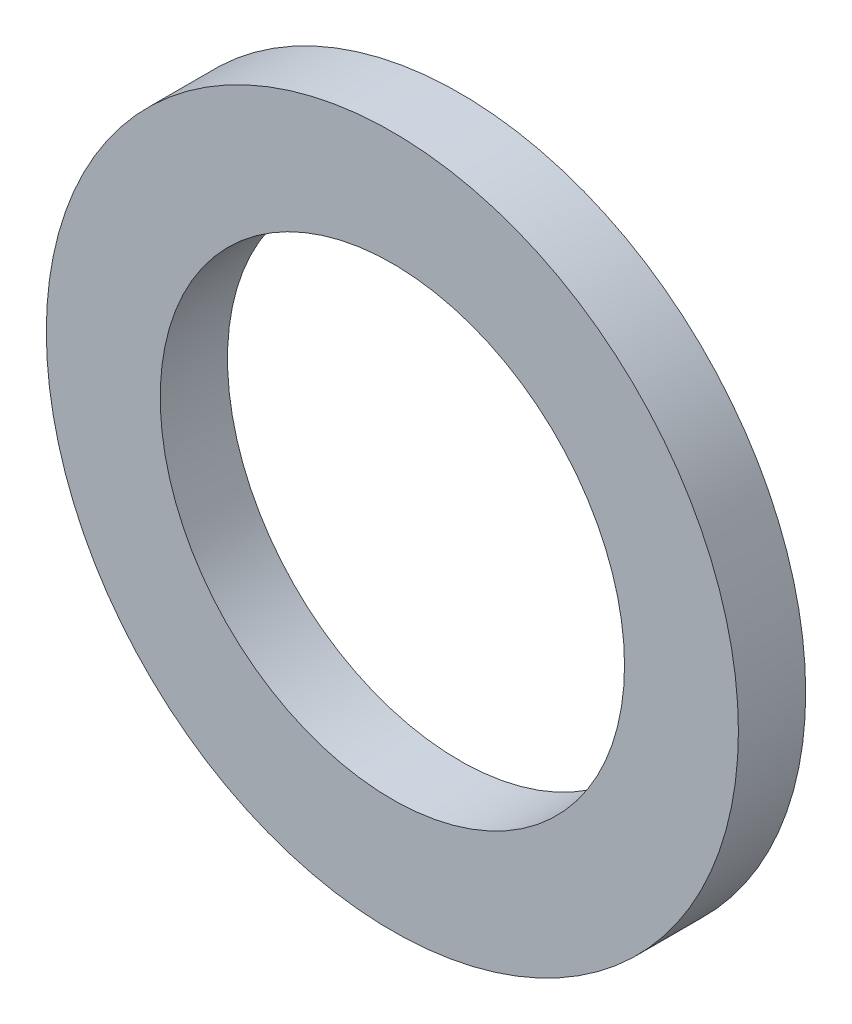
ISO-10303-21;
HEADER;
FILE_DESCRIPTION(('STEP AP214'),'2;1');
FILE_NAME('part.step','',(''),(''),'','','');
FILE_SCHEMA(('AUTOMOTIVE_DESIGN { 1 0 10303 214 1 1 1 1 }'));
ENDSEC;
DATA;
#1=APPLICATION_CONTEXT('core data for automotive mechanical design processes');
#2=APPLICATION_PROTOCOL_DEFINITION('international standard','automotive_design',2000,#1);
#3=PRODUCT_CONTEXT('',#1,'mechanical');
#4=PRODUCT('Part','Part','',(#3));
#5=PRODUCT_RELATED_PRODUCT_CATEGORY('part','',(#4));
#6=PRODUCT_DEFINITION_FORMATION('','',#4);
#7=PRODUCT_DEFINITION_CONTEXT('part definition',#1,'design');
#8=PRODUCT_DEFINITION('design','',#6,#7);
#9=PRODUCT_DEFINITION_SHAPE('','',#8);
#10=(LENGTH_UNIT() NAMED_UNIT(*) SI_UNIT(.MILLI.,.METRE.));
#11=(NAMED_UNIT(*) PLANE_ANGLE_UNIT() SI_UNIT($,.RADIAN.));
#12=(NAMED_UNIT(*) SI_UNIT($,.STERADIAN.) SOLID_ANGLE_UNIT());
#13=UNCERTAINTY_MEASURE_WITH_UNIT(LENGTH_MEASURE(1.E-05),#10,'distance_accuracy_value','');
#14=(GEOMETRIC_REPRESENTATION_CONTEXT(3) GLOBAL_UNCERTAINTY_ASSIGNED_CONTEXT((#13)) GLOBAL_UNIT_ASSIGNED_CONTEXT((#10,
#11,#12)) REPRESENTATION_CONTEXT('',''));
#15=CARTESIAN_POINT('',(0.,0.,0.));
#16=DIRECTION('',(0.,0.,1.));
#17=DIRECTION('',(1.,0.,0.));
#18=AXIS2_PLACEMENT_3D('',#15,#16,#17);
#19=CARTESIAN_POINT('',(0.,0.,2.));
#20=DIRECTION('',(0.,0.,1.));
#21=DIRECTION('',(1.,0.,0.));
#22=AXIS2_PLACEMENT_3D('',#19,#20,#21);
#23=PLANE('',#22);
#24=CARTESIAN_POINT('',(0.,0.,2.));
#25=DIRECTION('',(0.,0.,1.));
#26=DIRECTION('',(1.,0.,0.));
#27=AXIS2_PLACEMENT_3D('',#24,#25,#26);
#28=CIRCLE('',#27,10.285);
#29=CARTESIAN_POINT('',(10.285,0.,2.));
#30=VERTEX_POINT('',#29);
#31=EDGE_CURVE('E10',#30,#30,#28,.T.);
#32=ORIENTED_EDGE('',*,*,#31,.T.);
#33=EDGE_LOOP('',(#32));
#34=FACE_BOUND('',#33,.T.);
#35=CARTESIAN_POINT('',(0.,0.,2.));
#36=DIRECTION('',(0.,0.,1.));
#37=DIRECTION('',(1.,0.,0.));
#38=AXIS2_PLACEMENT_3D('',#35,#36,#37);
#39=CIRCLE('',#38,6.9);
#40=CARTESIAN_POINT('',(6.9,0.,2.));
#41=VERTEX_POINT('',#40);
#42=EDGE_CURVE('E47',#41,#41,#39,.T.);
#43=ORIENTED_EDGE('',*,*,#42,.F.);
#44=EDGE_LOOP('',(#43));
#45=FACE_BOUND('',#44,.T.);
#46=ADVANCED_FACE('F36',(#34,#45),#23,.T.);
#47=CARTESIAN_POINT('',(0.,0.,0.));
#48=DIRECTION('',(0.,0.,1.));
#49=DIRECTION('',(1.,0.,0.));
#50=AXIS2_PLACEMENT_3D('',#47,#48,#49);
#51=PLANE('',#50);
#52=CARTESIAN_POINT('',(0.,0.,0.));
#53=DIRECTION('',(0.,0.,1.));
#54=DIRECTION('',(1.,0.,0.));
#55=AXIS2_PLACEMENT_3D('',#52,#53,#54);
#56=CIRCLE('',#55,10.285);
#57=CARTESIAN_POINT('',(10.285,0.,0.));
#58=VERTEX_POINT('',#57);
#59=EDGE_CURVE('E40',#58,#58,#56,.T.);
#60=ORIENTED_EDGE('',*,*,#59,.F.);
#61=EDGE_LOOP('',(#60));
#62=FACE_BOUND('',#61,.T.);
#63=CARTESIAN_POINT('',(0.,0.,0.));
#64=DIRECTION('',(0.,0.,1.));
#65=DIRECTION('',(1.,0.,0.));
#66=AXIS2_PLACEMENT_3D('',#63,#64,#65);
#67=CIRCLE('',#66,6.9);
#68=CARTESIAN_POINT('',(6.9,0.,0.));
#69=VERTEX_POINT('',#68);
#70=EDGE_CURVE('E49',#69,#69,#67,.T.);
#71=ORIENTED_EDGE('',*,*,#70,.T.);
#72=EDGE_LOOP('',(#71));
#73=FACE_BOUND('',#72,.T.);
#74=ADVANCED_FACE('F59',(#62,#73),#51,.F.);
#75=CARTESIAN_POINT('',(0.,0.,2.));
#76=DIRECTION('',(0.,0.,-1.));
#77=DIRECTION('',(-1.,0.,0.));
#78=AXIS2_PLACEMENT_3D('',#75,#76,#77);
#79=CYLINDRICAL_SURFACE('',#78,10.285);
#80=ORIENTED_EDGE('',*,*,#31,.F.);
#81=EDGE_LOOP('',(#80));
#82=FACE_BOUND('',#81,.T.);
#83=ORIENTED_EDGE('',*,*,#59,.T.);
#84=EDGE_LOOP('',(#83));
#85=FACE_BOUND('',#84,.T.);
#86=ADVANCED_FACE('F38',(#82,#85),#79,.T.);
#87=CARTESIAN_POINT('',(0.,0.,2.));
#88=DIRECTION('',(0.,0.,-1.));
#89=DIRECTION('',(-1.,0.,0.));
#90=AXIS2_PLACEMENT_3D('',#87,#88,#89);
#91=CYLINDRICAL_SURFACE('',#90,6.9);
#92=ORIENTED_EDGE('',*,*,#42,.T.);
#93=EDGE_LOOP('',(#92));
#94=FACE_BOUND('',#93,.T.);
#95=ORIENTED_EDGE('',*,*,#70,.F.);
#96=EDGE_LOOP('',(#95));
#97=FACE_BOUND('',#96,.T.);
#98=ADVANCED_FACE('F55',(#94,#97),#91,.F.);
#99=CLOSED_SHELL('',(#46,#74,#86,#98));
#100=MANIFOLD_SOLID_BREP('B2',#99);
#101=ADVANCED_BREP_SHAPE_REPRESENTATION('',(#18,#100),#14);
#102=SHAPE_DEFINITION_REPRESENTATION(#9,#101);
ENDSEC;
END-ISO-10303-21;
